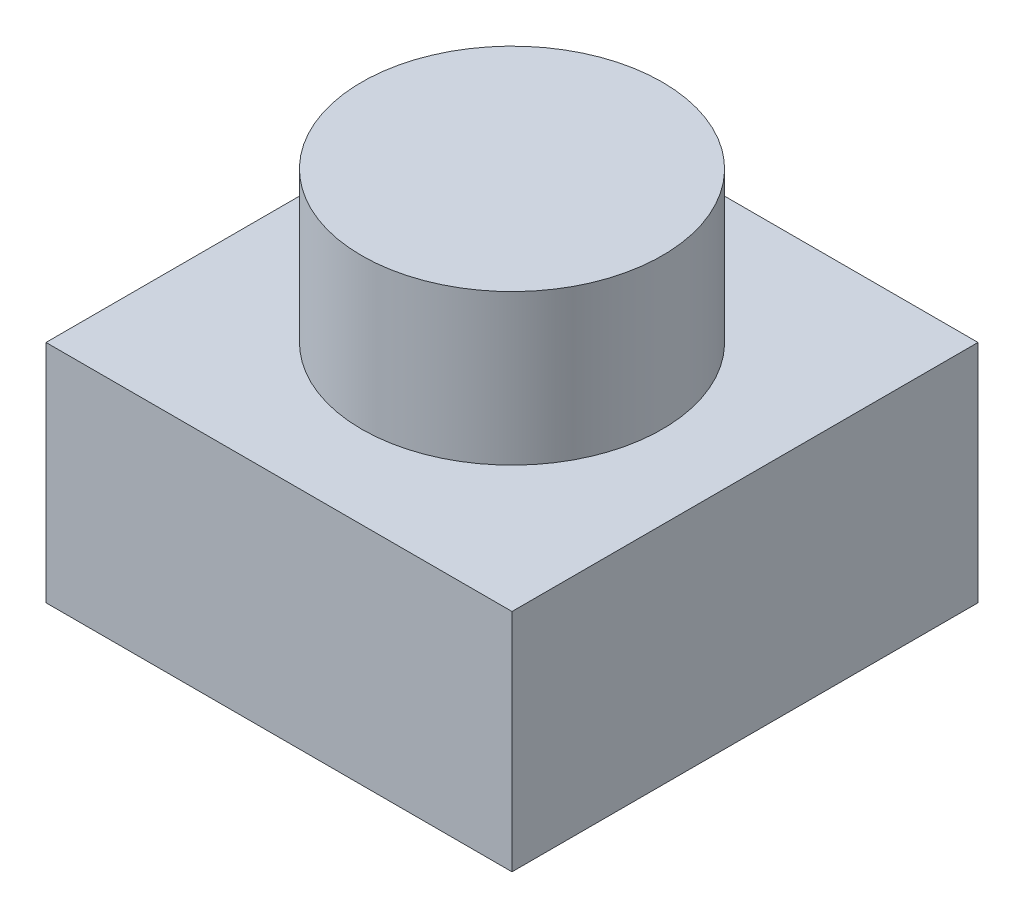
ISO-10303-21;
HEADER;
FILE_DESCRIPTION(('STEP AP214'),'2;1');
FILE_NAME('part.step','',(''),(''),'','','');
FILE_SCHEMA(('AUTOMOTIVE_DESIGN { 1 0 10303 214 1 1 1 1 }'));
ENDSEC;
DATA;
#1=APPLICATION_CONTEXT('core data for automotive mechanical design processes');
#2=APPLICATION_PROTOCOL_DEFINITION('international standard','automotive_design',2000,#1);
#3=PRODUCT_CONTEXT('',#1,'mechanical');
#4=PRODUCT('Part','Part','',(#3));
#5=PRODUCT_RELATED_PRODUCT_CATEGORY('part','',(#4));
#6=PRODUCT_DEFINITION_FORMATION('','',#4);
#7=PRODUCT_DEFINITION_CONTEXT('part definition',#1,'design');
#8=PRODUCT_DEFINITION('design','',#6,#7);
#9=PRODUCT_DEFINITION_SHAPE('','',#8);
#10=(LENGTH_UNIT() NAMED_UNIT(*) SI_UNIT(.MILLI.,.METRE.));
#11=(NAMED_UNIT(*) PLANE_ANGLE_UNIT() SI_UNIT($,.RADIAN.));
#12=(NAMED_UNIT(*) SI_UNIT($,.STERADIAN.) SOLID_ANGLE_UNIT());
#13=UNCERTAINTY_MEASURE_WITH_UNIT(LENGTH_MEASURE(1.E-05),#10,'distance_accuracy_value','');
#14=(GEOMETRIC_REPRESENTATION_CONTEXT(3) GLOBAL_UNCERTAINTY_ASSIGNED_CONTEXT((#13)) GLOBAL_UNIT_ASSIGNED_CONTEXT((#10,
#11,#12)) REPRESENTATION_CONTEXT('',''));
#15=CARTESIAN_POINT('',(0.,0.,0.));
#16=DIRECTION('',(0.,0.,1.));
#17=DIRECTION('',(1.,0.,0.));
#18=AXIS2_PLACEMENT_3D('',#15,#16,#17);
#19=CARTESIAN_POINT('',(3.1,3.,3.1));
#20=DIRECTION('',(-1.,0.,0.));
#21=DIRECTION('',(0.,0.,1.));
#22=AXIS2_PLACEMENT_3D('',#19,#20,#21);
#23=PLANE('',#22);
#24=DIRECTION('',(0.,0.,-1.));
#25=VECTOR('',#24,1.);
#26=CARTESIAN_POINT('',(3.1,0.,3.1));
#27=LINE('',#26,#25);
#28=CARTESIAN_POINT('',(3.1,0.,3.1));
#29=VERTEX_POINT('',#28);
#30=CARTESIAN_POINT('',(3.1,0.,-3.1));
#31=VERTEX_POINT('',#30);
#32=EDGE_CURVE('E103',#29,#31,#27,.T.);
#33=ORIENTED_EDGE('',*,*,#32,.T.);
#34=DIRECTION('',(0.,-1.,0.));
#35=VECTOR('',#34,1.);
#36=CARTESIAN_POINT('',(3.1,3.,-3.1));
#37=LINE('',#36,#35);
#38=CARTESIAN_POINT('',(3.1,3.,-3.1));
#39=VERTEX_POINT('',#38);
#40=EDGE_CURVE('E40',#39,#31,#37,.T.);
#41=ORIENTED_EDGE('',*,*,#40,.F.);
#42=DIRECTION('',(0.,0.,-1.));
#43=VECTOR('',#42,1.);
#44=CARTESIAN_POINT('',(3.1,3.,3.1));
#45=LINE('',#44,#43);
#46=CARTESIAN_POINT('',(3.1,3.,3.1));
#47=VERTEX_POINT('',#46);
#48=EDGE_CURVE('E90',#47,#39,#45,.T.);
#49=ORIENTED_EDGE('',*,*,#48,.F.);
#50=DIRECTION('',(0.,-1.,0.));
#51=VECTOR('',#50,1.);
#52=CARTESIAN_POINT('',(3.1,3.,3.1));
#53=LINE('',#52,#51);
#54=EDGE_CURVE('E99',#47,#29,#53,.T.);
#55=ORIENTED_EDGE('',*,*,#54,.T.);
#56=EDGE_LOOP('',(#33,#41,#49,#55));
#57=FACE_BOUND('',#56,.T.);
#58=ADVANCED_FACE('F37',(#57),#23,.F.);
#59=CARTESIAN_POINT('',(-3.1,3.,-3.1));
#60=DIRECTION('',(0.,0.,1.));
#61=DIRECTION('',(1.,0.,0.));
#62=AXIS2_PLACEMENT_3D('',#59,#60,#61);
#63=PLANE('',#62);
#64=DIRECTION('',(-1.,0.,0.));
#65=VECTOR('',#64,1.);
#66=CARTESIAN_POINT('',(-3.1,0.,-3.1));
#67=LINE('',#66,#65);
#68=CARTESIAN_POINT('',(-3.1,0.,-3.1));
#69=VERTEX_POINT('',#68);
#70=EDGE_CURVE('E95',#31,#69,#67,.T.);
#71=ORIENTED_EDGE('',*,*,#70,.T.);
#72=DIRECTION('',(0.,-1.,0.));
#73=VECTOR('',#72,1.);
#74=CARTESIAN_POINT('',(-3.1,3.,-3.1));
#75=LINE('',#74,#73);
#76=CARTESIAN_POINT('',(-3.1,3.,-3.1));
#77=VERTEX_POINT('',#76);
#78=EDGE_CURVE('E93',#77,#69,#75,.T.);
#79=ORIENTED_EDGE('',*,*,#78,.F.);
#80=DIRECTION('',(-1.,0.,0.));
#81=VECTOR('',#80,1.);
#82=CARTESIAN_POINT('',(-3.1,3.,-3.1));
#83=LINE('',#82,#81);
#84=EDGE_CURVE('E85',#39,#77,#83,.T.);
#85=ORIENTED_EDGE('',*,*,#84,.F.);
#86=ORIENTED_EDGE('',*,*,#40,.T.);
#87=EDGE_LOOP('',(#71,#79,#85,#86));
#88=FACE_BOUND('',#87,.T.);
#89=ADVANCED_FACE('F94',(#88),#63,.F.);
#90=CARTESIAN_POINT('',(-3.1,3.,3.1));
#91=DIRECTION('',(1.,0.,0.));
#92=DIRECTION('',(0.,0.,-1.));
#93=AXIS2_PLACEMENT_3D('',#90,#91,#92);
#94=PLANE('',#93);
#95=DIRECTION('',(0.,0.,1.));
#96=VECTOR('',#95,1.);
#97=CARTESIAN_POINT('',(-3.1,0.,3.1));
#98=LINE('',#97,#96);
#99=CARTESIAN_POINT('',(-3.1,0.,3.1));
#100=VERTEX_POINT('',#99);
#101=EDGE_CURVE('E71',#69,#100,#98,.T.);
#102=ORIENTED_EDGE('',*,*,#101,.T.);
#103=DIRECTION('',(0.,-1.,0.));
#104=VECTOR('',#103,1.);
#105=CARTESIAN_POINT('',(-3.1,3.,3.1));
#106=LINE('',#105,#104);
#107=CARTESIAN_POINT('',(-3.1,3.,3.1));
#108=VERTEX_POINT('',#107);
#109=EDGE_CURVE('E96',#108,#100,#106,.T.);
#110=ORIENTED_EDGE('',*,*,#109,.F.);
#111=DIRECTION('',(0.,0.,1.));
#112=VECTOR('',#111,1.);
#113=CARTESIAN_POINT('',(-3.1,3.,3.1));
#114=LINE('',#113,#112);
#115=EDGE_CURVE('E88',#77,#108,#114,.T.);
#116=ORIENTED_EDGE('',*,*,#115,.F.);
#117=ORIENTED_EDGE('',*,*,#78,.T.);
#118=EDGE_LOOP('',(#102,#110,#116,#117));
#119=FACE_BOUND('',#118,.T.);
#120=ADVANCED_FACE('F97',(#119),#94,.F.);
#121=CARTESIAN_POINT('',(-3.1,3.,3.1));
#122=DIRECTION('',(0.,0.,-1.));
#123=DIRECTION('',(-1.,0.,0.));
#124=AXIS2_PLACEMENT_3D('',#121,#122,#123);
#125=PLANE('',#124);
#126=DIRECTION('',(1.,0.,0.));
#127=VECTOR('',#126,1.);
#128=CARTESIAN_POINT('',(-3.1,0.,3.1));
#129=LINE('',#128,#127);
#130=EDGE_CURVE('E77',#100,#29,#129,.T.);
#131=ORIENTED_EDGE('',*,*,#130,.T.);
#132=ORIENTED_EDGE('',*,*,#54,.F.);
#133=DIRECTION('',(1.,0.,0.));
#134=VECTOR('',#133,1.);
#135=CARTESIAN_POINT('',(-3.1,3.,3.1));
#136=LINE('',#135,#134);
#137=EDGE_CURVE('E54',#108,#47,#136,.T.);
#138=ORIENTED_EDGE('',*,*,#137,.F.);
#139=ORIENTED_EDGE('',*,*,#109,.T.);
#140=EDGE_LOOP('',(#131,#132,#138,#139));
#141=FACE_BOUND('',#140,.T.);
#142=ADVANCED_FACE('F111',(#141),#125,.F.);
#143=CARTESIAN_POINT('',(0.,3.,0.));
#144=DIRECTION('',(0.,-1.,0.));
#145=DIRECTION('',(0.,0.,-1.));
#146=AXIS2_PLACEMENT_3D('',#143,#144,#145);
#147=PLANE('',#146);
#148=CARTESIAN_POINT('',(0.,3.,0.));
#149=DIRECTION('',(0.,1.,0.));
#150=DIRECTION('',(0.,0.,1.));
#151=AXIS2_PLACEMENT_3D('',#148,#149,#150);
#152=CIRCLE('',#151,2.);
#153=CARTESIAN_POINT('',(0.,3.,2.));
#154=VERTEX_POINT('',#153);
#155=EDGE_CURVE('E11',#154,#154,#152,.T.);
#156=ORIENTED_EDGE('',*,*,#155,.F.);
#157=EDGE_LOOP('',(#156));
#158=FACE_BOUND('',#157,.T.);
#159=ORIENTED_EDGE('',*,*,#48,.T.);
#160=ORIENTED_EDGE('',*,*,#84,.T.);
#161=ORIENTED_EDGE('',*,*,#115,.T.);
#162=ORIENTED_EDGE('',*,*,#137,.T.);
#163=EDGE_LOOP('',(#159,#160,#161,#162));
#164=FACE_BOUND('',#163,.T.);
#165=ADVANCED_FACE('F86',(#158,#164),#147,.F.);
#166=CARTESIAN_POINT('',(0.,0.,0.));
#167=DIRECTION('',(0.,-1.,0.));
#168=DIRECTION('',(0.,0.,-1.));
#169=AXIS2_PLACEMENT_3D('',#166,#167,#168);
#170=PLANE('',#169);
#171=ORIENTED_EDGE('',*,*,#32,.F.);
#172=ORIENTED_EDGE('',*,*,#130,.F.);
#173=ORIENTED_EDGE('',*,*,#101,.F.);
#174=ORIENTED_EDGE('',*,*,#70,.F.);
#175=EDGE_LOOP('',(#171,#172,#173,#174));
#176=FACE_BOUND('',#175,.T.);
#177=ADVANCED_FACE('F114',(#176),#170,.T.);
#178=CARTESIAN_POINT('',(0.,5.,0.));
#179=DIRECTION('',(0.,-1.,0.));
#180=DIRECTION('',(0.,0.,-1.));
#181=AXIS2_PLACEMENT_3D('',#178,#179,#180);
#182=CYLINDRICAL_SURFACE('',#181,2.);
#183=CARTESIAN_POINT('',(0.,5.,0.));
#184=DIRECTION('',(0.,1.,0.));
#185=DIRECTION('',(0.,0.,1.));
#186=AXIS2_PLACEMENT_3D('',#183,#184,#185);
#187=CIRCLE('',#186,2.);
#188=CARTESIAN_POINT('',(0.,5.,2.));
#189=VERTEX_POINT('',#188);
#190=EDGE_CURVE('E106',#189,#189,#187,.T.);
#191=ORIENTED_EDGE('',*,*,#190,.F.);
#192=EDGE_LOOP('',(#191));
#193=FACE_BOUND('',#192,.T.);
#194=ORIENTED_EDGE('',*,*,#155,.T.);
#195=EDGE_LOOP('',(#194));
#196=FACE_BOUND('',#195,.T.);
#197=ADVANCED_FACE('F122',(#193,#196),#182,.T.);
#198=CARTESIAN_POINT('',(0.,5.,0.));
#199=DIRECTION('',(0.,1.,0.));
#200=DIRECTION('',(0.,0.,1.));
#201=AXIS2_PLACEMENT_3D('',#198,#199,#200);
#202=PLANE('',#201);
#203=ORIENTED_EDGE('',*,*,#190,.T.);
#204=EDGE_LOOP('',(#203));
#205=FACE_BOUND('',#204,.T.);
#206=ADVANCED_FACE('F120',(#205),#202,.T.);
#207=CLOSED_SHELL('',(#58,#89,#120,#142,#165,#177,#197,#206));
#208=MANIFOLD_SOLID_BREP('B2',#207);
#209=ADVANCED_BREP_SHAPE_REPRESENTATION('',(#18,#208),#14);
#210=SHAPE_DEFINITION_REPRESENTATION(#9,#209);
ENDSEC;
END-ISO-10303-21;
